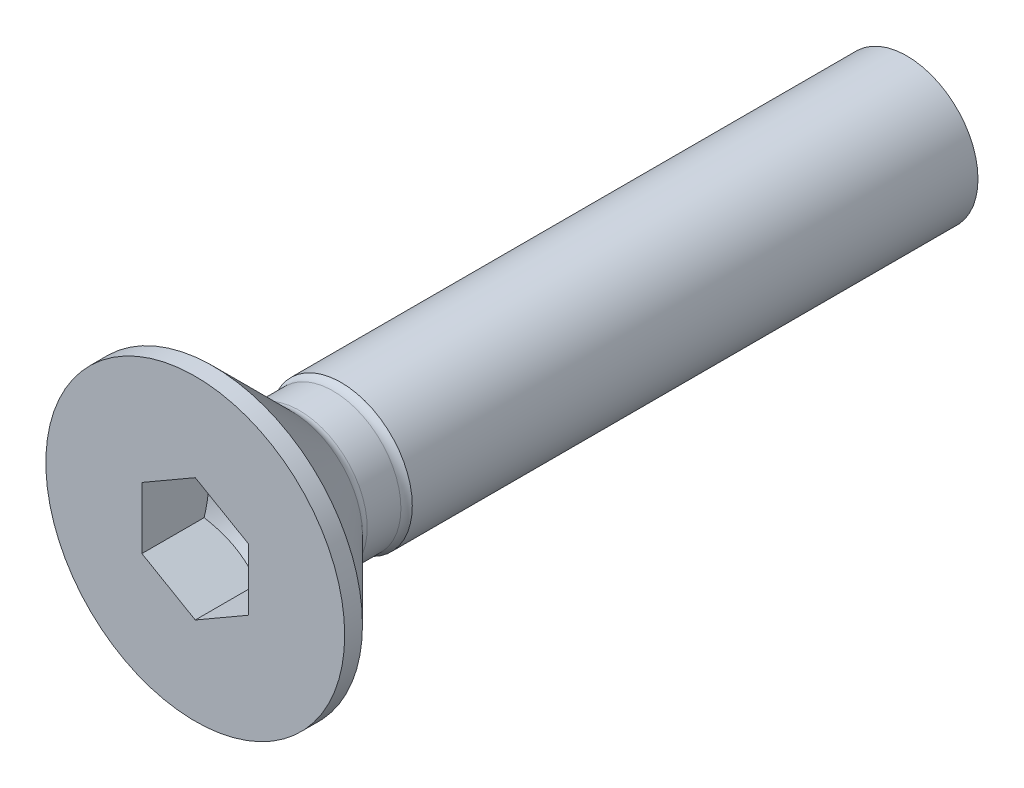
ISO-10303-21;
HEADER;
FILE_DESCRIPTION(('STEP AP214'),'2;1');
FILE_NAME('part.step','',(''),(''),'','','');
FILE_SCHEMA(('AUTOMOTIVE_DESIGN { 1 0 10303 214 1 1 1 1 }'));
ENDSEC;
DATA;
#1=APPLICATION_CONTEXT('core data for automotive mechanical design processes');
#2=APPLICATION_PROTOCOL_DEFINITION('international standard','automotive_design',2000,#1);
#3=PRODUCT_CONTEXT('',#1,'mechanical');
#4=PRODUCT('Part','Part','',(#3));
#5=PRODUCT_RELATED_PRODUCT_CATEGORY('part','',(#4));
#6=PRODUCT_DEFINITION_FORMATION('','',#4);
#7=PRODUCT_DEFINITION_CONTEXT('part definition',#1,'design');
#8=PRODUCT_DEFINITION('design','',#6,#7);
#9=PRODUCT_DEFINITION_SHAPE('','',#8);
#10=(LENGTH_UNIT() NAMED_UNIT(*) SI_UNIT(.MILLI.,.METRE.));
#11=(NAMED_UNIT(*) PLANE_ANGLE_UNIT() SI_UNIT($,.RADIAN.));
#12=(NAMED_UNIT(*) SI_UNIT($,.STERADIAN.) SOLID_ANGLE_UNIT());
#13=UNCERTAINTY_MEASURE_WITH_UNIT(LENGTH_MEASURE(1.E-05),#10,'distance_accuracy_value','');
#14=(GEOMETRIC_REPRESENTATION_CONTEXT(3) GLOBAL_UNCERTAINTY_ASSIGNED_CONTEXT((#13)) GLOBAL_UNIT_ASSIGNED_CONTEXT((#10,
#11,#12)) REPRESENTATION_CONTEXT('',''));
#15=CARTESIAN_POINT('',(0.,0.,0.));
#16=DIRECTION('',(0.,0.,1.));
#17=DIRECTION('',(1.,0.,0.));
#18=AXIS2_PLACEMENT_3D('',#15,#16,#17);
#19=CARTESIAN_POINT('',(0.,4.2,0.));
#20=DIRECTION('',(0.,0.,-1.));
#21=DIRECTION('',(-1.,0.,0.));
#22=AXIS2_PLACEMENT_3D('',#19,#20,#21);
#23=PLANE('',#22);
#24=CARTESIAN_POINT('',(0.,0.,0.));
#25=DIRECTION('',(0.,0.,1.));
#26=DIRECTION('',(1.,0.,0.));
#27=AXIS2_PLACEMENT_3D('',#24,#25,#26);
#28=CIRCLE('',#27,4.2);
#29=CARTESIAN_POINT('',(4.2,0.,0.));
#30=VERTEX_POINT('',#29);
#31=EDGE_CURVE('E107',#30,#30,#28,.T.);
#32=ORIENTED_EDGE('',*,*,#31,.T.);
#33=EDGE_LOOP('',(#32));
#34=FACE_BOUND('',#33,.T.);
#35=DIRECTION('',(-0.866025403784438,-0.5,0.));
#36=VECTOR('',#35,1.);
#37=CARTESIAN_POINT('',(1.49999930062484,-0.866025,0.));
#38=LINE('',#37,#36);
#39=CARTESIAN_POINT('',(1.49999930062484,-0.866025,0.));
#40=VERTEX_POINT('',#39);
#41=CARTESIAN_POINT('',(0.,-1.73205,0.));
#42=VERTEX_POINT('',#41);
#43=EDGE_CURVE('E31',#40,#42,#38,.T.);
#44=ORIENTED_EDGE('',*,*,#43,.T.);
#45=DIRECTION('',(-0.866025403784439,0.5,0.));
#46=VECTOR('',#45,1.);
#47=CARTESIAN_POINT('',(0.,-1.73205,0.));
#48=LINE('',#47,#46);
#49=CARTESIAN_POINT('',(-1.49999930062484,-0.866025,0.));
#50=VERTEX_POINT('',#49);
#51=EDGE_CURVE('E174',#42,#50,#48,.T.);
#52=ORIENTED_EDGE('',*,*,#51,.T.);
#53=DIRECTION('',(0.,1.,0.));
#54=VECTOR('',#53,1.);
#55=CARTESIAN_POINT('',(-1.49999930062484,-0.866025,0.));
#56=LINE('',#55,#54);
#57=CARTESIAN_POINT('',(-1.49999930062484,0.866025,0.));
#58=VERTEX_POINT('',#57);
#59=EDGE_CURVE('E225',#50,#58,#56,.T.);
#60=ORIENTED_EDGE('',*,*,#59,.T.);
#61=DIRECTION('',(0.866025403784439,0.5,0.));
#62=VECTOR('',#61,1.);
#63=CARTESIAN_POINT('',(-1.49999930062484,0.866025,0.));
#64=LINE('',#63,#62);
#65=CARTESIAN_POINT('',(0.,1.73205,0.));
#66=VERTEX_POINT('',#65);
#67=EDGE_CURVE('E223',#58,#66,#64,.T.);
#68=ORIENTED_EDGE('',*,*,#67,.T.);
#69=DIRECTION('',(0.866025403784439,-0.5,0.));
#70=VECTOR('',#69,1.);
#71=CARTESIAN_POINT('',(0.,1.73205,0.));
#72=LINE('',#71,#70);
#73=CARTESIAN_POINT('',(1.49999930062484,0.866025,0.));
#74=VERTEX_POINT('',#73);
#75=EDGE_CURVE('E96',#66,#74,#72,.T.);
#76=ORIENTED_EDGE('',*,*,#75,.T.);
#77=DIRECTION('',(0.,-1.,0.));
#78=VECTOR('',#77,1.);
#79=CARTESIAN_POINT('',(1.49999930062484,0.866025,0.));
#80=LINE('',#79,#78);
#81=EDGE_CURVE('E92',#74,#40,#80,.T.);
#82=ORIENTED_EDGE('',*,*,#81,.T.);
#83=EDGE_LOOP('',(#44,#52,#60,#68,#76,#82));
#84=FACE_BOUND('',#83,.T.);
#85=ADVANCED_FACE('F17',(#34,#84),#23,.F.);
#86=CARTESIAN_POINT('',(0.,0.,-20.));
#87=DIRECTION('',(0.,0.,1.));
#88=DIRECTION('',(1.,0.,0.));
#89=AXIS2_PLACEMENT_3D('',#86,#87,#88);
#90=PLANE('',#89);
#91=CARTESIAN_POINT('',(0.,0.,-20.));
#92=DIRECTION('',(0.,0.,1.));
#93=DIRECTION('',(1.,0.,0.));
#94=AXIS2_PLACEMENT_3D('',#91,#92,#93);
#95=CIRCLE('',#94,2.);
#96=CARTESIAN_POINT('',(2.,0.,-20.));
#97=VERTEX_POINT('',#96);
#98=EDGE_CURVE('E11',#97,#97,#95,.T.);
#99=ORIENTED_EDGE('',*,*,#98,.F.);
#100=EDGE_LOOP('',(#99));
#101=FACE_BOUND('',#100,.T.);
#102=ADVANCED_FACE('F130',(#101),#90,.F.);
#103=CARTESIAN_POINT('',(0.,0.,0.));
#104=DIRECTION('',(0.,0.,1.));
#105=DIRECTION('',(1.,0.,0.));
#106=AXIS2_PLACEMENT_3D('',#103,#104,#105);
#107=CYLINDRICAL_SURFACE('',#106,2.);
#108=CARTESIAN_POINT('',(0.,0.,-4.1));
#109=DIRECTION('',(0.,0.,1.));
#110=DIRECTION('',(1.,0.,0.));
#111=AXIS2_PLACEMENT_3D('',#108,#109,#110);
#112=CIRCLE('',#111,2.);
#113=CARTESIAN_POINT('',(2.,0.,-4.1));
#114=VERTEX_POINT('',#113);
#115=EDGE_CURVE('E24',#114,#114,#112,.T.);
#116=ORIENTED_EDGE('',*,*,#115,.F.);
#117=EDGE_LOOP('',(#116));
#118=FACE_BOUND('',#117,.T.);
#119=ORIENTED_EDGE('',*,*,#98,.T.);
#120=EDGE_LOOP('',(#119));
#121=FACE_BOUND('',#120,.T.);
#122=ADVANCED_FACE('F127',(#118,#121),#107,.T.);
#123=CARTESIAN_POINT('',(0.,0.,-3.8737258300203));
#124=DIRECTION('',(0.,0.,1.));
#125=DIRECTION('',(1.,0.,0.));
#126=AXIS2_PLACEMENT_3D('',#123,#124,#125);
#127=TOROIDAL_SURFACE('',#126,2.2262741699797,0.32);
#128=ORIENTED_EDGE('',*,*,#115,.T.);
#129=EDGE_LOOP('',(#128));
#130=FACE_BOUND('',#129,.T.);
#131=CARTESIAN_POINT('',(0.,0.,-3.8737258300203));
#132=DIRECTION('',(0.,0.,1.));
#133=DIRECTION('',(1.,0.,0.));
#134=AXIS2_PLACEMENT_3D('',#131,#132,#133);
#135=CIRCLE('',#134,1.9062741699797);
#136=CARTESIAN_POINT('',(1.9062741699797,0.,-3.8737258300203));
#137=VERTEX_POINT('',#136);
#138=EDGE_CURVE('E119',#137,#137,#135,.T.);
#139=ORIENTED_EDGE('',*,*,#138,.F.);
#140=EDGE_LOOP('',(#139));
#141=FACE_BOUND('',#140,.T.);
#142=ADVANCED_FACE('F124',(#130,#141),#127,.F.);
#143=CARTESIAN_POINT('',(0.,0.,0.));
#144=DIRECTION('',(0.,0.,1.));
#145=DIRECTION('',(1.,0.,0.));
#146=AXIS2_PLACEMENT_3D('',#143,#144,#145);
#147=CYLINDRICAL_SURFACE('',#146,1.9062741699797);
#148=CARTESIAN_POINT('',(0.,0.,-2.9262741699797));
#149=DIRECTION('',(0.,0.,1.));
#150=DIRECTION('',(1.,0.,0.));
#151=AXIS2_PLACEMENT_3D('',#148,#149,#150);
#152=CIRCLE('',#151,1.9062741699797);
#153=CARTESIAN_POINT('',(1.9062741699797,0.,-2.9262741699797));
#154=VERTEX_POINT('',#153);
#155=EDGE_CURVE('E116',#154,#154,#152,.T.);
#156=ORIENTED_EDGE('',*,*,#155,.F.);
#157=EDGE_LOOP('',(#156));
#158=FACE_BOUND('',#157,.T.);
#159=ORIENTED_EDGE('',*,*,#138,.T.);
#160=EDGE_LOOP('',(#159));
#161=FACE_BOUND('',#160,.T.);
#162=ADVANCED_FACE('F143',(#158,#161),#147,.T.);
#163=CARTESIAN_POINT('',(0.,0.,-2.9262741699797));
#164=DIRECTION('',(0.,0.,1.));
#165=DIRECTION('',(1.,0.,0.));
#166=AXIS2_PLACEMENT_3D('',#163,#164,#165);
#167=TOROIDAL_SURFACE('',#166,2.2262741699797,0.32);
#168=ORIENTED_EDGE('',*,*,#155,.T.);
#169=EDGE_LOOP('',(#168));
#170=FACE_BOUND('',#169,.T.);
#171=CARTESIAN_POINT('',(0.,0.,-2.7));
#172=DIRECTION('',(0.,0.,1.));
#173=DIRECTION('',(1.,0.,0.));
#174=AXIS2_PLACEMENT_3D('',#171,#172,#173);
#175=CIRCLE('',#174,2.);
#176=CARTESIAN_POINT('',(2.,0.,-2.7));
#177=VERTEX_POINT('',#176);
#178=EDGE_CURVE('E113',#177,#177,#175,.T.);
#179=ORIENTED_EDGE('',*,*,#178,.F.);
#180=EDGE_LOOP('',(#179));
#181=FACE_BOUND('',#180,.T.);
#182=ADVANCED_FACE('F146',(#170,#181),#167,.F.);
#183=CARTESIAN_POINT('',(0.,0.,-2.7));
#184=DIRECTION('',(0.,0.,1.));
#185=DIRECTION('',(1.,0.,0.));
#186=AXIS2_PLACEMENT_3D('',#183,#184,#185);
#187=CONICAL_SURFACE('',#186,2.,0.785398163397448);
#188=CARTESIAN_POINT('',(0.,0.,-0.5));
#189=DIRECTION('',(0.,0.,1.));
#190=DIRECTION('',(1.,0.,0.));
#191=AXIS2_PLACEMENT_3D('',#188,#189,#190);
#192=CIRCLE('',#191,4.2);
#193=CARTESIAN_POINT('',(4.2,0.,-0.5));
#194=VERTEX_POINT('',#193);
#195=EDGE_CURVE('E110',#194,#194,#192,.T.);
#196=ORIENTED_EDGE('',*,*,#195,.F.);
#197=EDGE_LOOP('',(#196));
#198=FACE_BOUND('',#197,.T.);
#199=ORIENTED_EDGE('',*,*,#178,.T.);
#200=EDGE_LOOP('',(#199));
#201=FACE_BOUND('',#200,.T.);
#202=ADVANCED_FACE('F150',(#198,#201),#187,.T.);
#203=CARTESIAN_POINT('',(0.,0.,0.));
#204=DIRECTION('',(0.,0.,1.));
#205=DIRECTION('',(1.,0.,0.));
#206=AXIS2_PLACEMENT_3D('',#203,#204,#205);
#207=CYLINDRICAL_SURFACE('',#206,4.2);
#208=ORIENTED_EDGE('',*,*,#31,.F.);
#209=EDGE_LOOP('',(#208));
#210=FACE_BOUND('',#209,.T.);
#211=ORIENTED_EDGE('',*,*,#195,.T.);
#212=EDGE_LOOP('',(#211));
#213=FACE_BOUND('',#212,.T.);
#214=ADVANCED_FACE('F154',(#210,#213),#207,.T.);
#215=CARTESIAN_POINT('',(1.49999930062484,-0.866025,-2.74999953374989));
#216=DIRECTION('',(-0.5,0.866025403784438,0.));
#217=DIRECTION('',(0.866025403784439,0.5,0.));
#218=AXIS2_PLACEMENT_3D('',#215,#216,#217);
#219=PLANE('',#218);
#220=DIRECTION('',(0.,0.,1.));
#221=VECTOR('',#220,1.);
#222=CARTESIAN_POINT('',(0.,-1.73205,-2.74999953374989));
#223=LINE('',#222,#221);
#224=CARTESIAN_POINT('',(0.,-1.73205,-1.75));
#225=VERTEX_POINT('',#224);
#226=EDGE_CURVE('E105',#225,#42,#223,.T.);
#227=ORIENTED_EDGE('',*,*,#226,.T.);
#228=ORIENTED_EDGE('',*,*,#43,.F.);
#229=DIRECTION('',(0.,0.,1.));
#230=VECTOR('',#229,1.);
#231=CARTESIAN_POINT('',(1.49999930062484,-0.866025,-2.74999953374989));
#232=LINE('',#231,#230);
#233=CARTESIAN_POINT('',(1.49999930062484,-0.866025,-1.75));
#234=VERTEX_POINT('',#233);
#235=EDGE_CURVE('E86',#234,#40,#232,.T.);
#236=ORIENTED_EDGE('',*,*,#235,.F.);
#237=CARTESIAN_POINT('',(-1.99999999680739E-07,-1.73205011547005,-1.74999993333332));
#238=CARTESIAN_POINT('',(0.0659156883140374,-1.69399355960807,-1.77197826971665));
#239=CARTESIAN_POINT('',(0.132400561630831,-1.65560850010158,-1.79196641723317));
#240=CARTESIAN_POINT('',(0.266521449648073,-1.57817376930088,-1.82685513031264));
#241=CARTESIAN_POINT('',(0.334159846643437,-1.53912272258805,-1.84174335491524));
#242=CARTESIAN_POINT('',(0.468598431785278,-1.46150456926693,-1.86491795250505));
#243=CARTESIAN_POINT('',(0.535377940612902,-1.42294940186895,-1.87335858322253));
#244=CARTESIAN_POINT('',(0.669251014383081,-1.3456577466905,-1.88343305499451));
#245=CARTESIAN_POINT('',(0.736344093066486,-1.30692153965187,-1.88507524057936));
#246=CARTESIAN_POINT('',(0.861700339375889,-1.23454707710054,-1.88165022910074));
#247=CARTESIAN_POINT('',(0.919982317618543,-1.20089796127324,-1.87742398588357));
#248=CARTESIAN_POINT('',(1.03616658598195,-1.13381894265803,-1.86403197749463));
#249=CARTESIAN_POINT('',(1.09406847455153,-1.10038927170579,-1.8548616421055));
#250=CARTESIAN_POINT('',(1.21049209394498,-1.03317206370895,-1.83193757598473));
#251=CARTESIAN_POINT('',(1.26899909720332,-0.99939302962827,-1.81808671686208));
#252=CARTESIAN_POINT('',(1.38514072357652,-0.932338630377582,-1.78665112132236));
#253=CARTESIAN_POINT('',(1.44277683345494,-0.899062406824236,-1.76907376628985));
#254=CARTESIAN_POINT('',(1.49999950062484,-0.866024884529945,-1.74999993333332));
#255=B_SPLINE_CURVE_WITH_KNOTS('',3,(#237,#238,#239,#240,#241,#242,#243,#244,#245,#246,#247,
#248,#249,#250,#251,#252,#253,#254),.UNSPECIFIED.,.F.,.F.,(4,2,2,2,2,2,2,2,4),(0.,
0.237761913623106,0.476095172847885,0.708530420620331,0.940680288567599,1.14278046683928,
1.34506778348019,1.5518408666055,1.75820814090333),.UNSPECIFIED.);
#256=EDGE_CURVE('E79',#225,#234,#255,.T.);
#257=ORIENTED_EDGE('',*,*,#256,.F.);
#258=EDGE_LOOP('',(#227,#228,#236,#257));
#259=FACE_BOUND('',#258,.T.);
#260=ADVANCED_FACE('F87',(#259),#219,.T.);
#261=CARTESIAN_POINT('',(0.,-1.73205,-2.74999953374989));
#262=DIRECTION('',(0.5,0.866025403784439,0.));
#263=DIRECTION('',(0.866025403784439,-0.5,0.));
#264=AXIS2_PLACEMENT_3D('',#261,#262,#263);
#265=PLANE('',#264);
#266=DIRECTION('',(0.,0.,1.));
#267=VECTOR('',#266,1.);
#268=CARTESIAN_POINT('',(-1.49999930062484,-0.866025,-2.74999953374989));
#269=LINE('',#268,#267);
#270=CARTESIAN_POINT('',(-1.49999930062484,-0.866025,-1.75));
#271=VERTEX_POINT('',#270);
#272=EDGE_CURVE('E103',#271,#50,#269,.T.);
#273=ORIENTED_EDGE('',*,*,#272,.T.);
#274=ORIENTED_EDGE('',*,*,#51,.F.);
#275=ORIENTED_EDGE('',*,*,#226,.F.);
#276=CARTESIAN_POINT('',(-1.49999950062484,-0.866024884529947,-1.74999993333332));
#277=CARTESIAN_POINT('',(-1.4340836123108,-0.904081440391929,-1.77197826971665));
#278=CARTESIAN_POINT('',(-1.36759873899401,-0.942466499898418,-1.79196641723317));
#279=CARTESIAN_POINT('',(-1.23347785097676,-1.01990123069912,-1.82685513031264));
#280=CARTESIAN_POINT('',(-1.1658394539814,-1.05895227741195,-1.84174335491524));
#281=CARTESIAN_POINT('',(-1.03140086883956,-1.13657043073307,-1.86491795250505));
#282=CARTESIAN_POINT('',(-0.964621360011935,-1.17512559813105,-1.87335858322253));
#283=CARTESIAN_POINT('',(-0.830748286241757,-1.2524172533095,-1.88343305499451));
#284=CARTESIAN_POINT('',(-0.763655207558351,-1.29115346034813,-1.88507524057936));
#285=CARTESIAN_POINT('',(-0.638298961248948,-1.36352792289946,-1.88165022910074));
#286=CARTESIAN_POINT('',(-0.580016983006295,-1.39717703872676,-1.87742398588357));
#287=CARTESIAN_POINT('',(-0.46383271464289,-1.46425605734197,-1.86403197749463));
#288=CARTESIAN_POINT('',(-0.405930826073305,-1.49768572829421,-1.8548616421055));
#289=CARTESIAN_POINT('',(-0.289507206679853,-1.56490293629105,-1.83193757598473));
#290=CARTESIAN_POINT('',(-0.231000203421515,-1.59868197037173,-1.81808671686208));
#291=CARTESIAN_POINT('',(-0.114858577048315,-1.66573636962242,-1.78665112132236));
#292=CARTESIAN_POINT('',(-0.0572224671698999,-1.69901259317576,-1.76907376628985));
#293=CARTESIAN_POINT('',(2.00000000349948E-07,-1.73205011547005,-1.74999993333332));
#294=B_SPLINE_CURVE_WITH_KNOTS('',3,(#276,#277,#278,#279,#280,#281,#282,#283,#284,#285,#286,
#287,#288,#289,#290,#291,#292,#293),.UNSPECIFIED.,.F.,.F.,(4,2,2,2,2,2,2,2,4),(0.,
0.237761913623106,0.476095172847884,0.70853042062033,0.940680288567598,1.14278046683928,
1.34506778348018,1.5518408666055,1.75820814090332),.UNSPECIFIED.);
#295=EDGE_CURVE('E83',#271,#225,#294,.T.);
#296=ORIENTED_EDGE('',*,*,#295,.F.);
#297=EDGE_LOOP('',(#273,#274,#275,#296));
#298=FACE_BOUND('',#297,.T.);
#299=ADVANCED_FACE('F162',(#298),#265,.T.);
#300=CARTESIAN_POINT('',(-1.49999930062484,-0.866025,-2.74999953374989));
#301=DIRECTION('',(1.,0.,0.));
#302=DIRECTION('',(0.,-1.,0.));
#303=AXIS2_PLACEMENT_3D('',#300,#301,#302);
#304=PLANE('',#303);
#305=DIRECTION('',(0.,0.,1.));
#306=VECTOR('',#305,1.);
#307=CARTESIAN_POINT('',(-1.49999930062484,0.866025,-2.74999953374989));
#308=LINE('',#307,#306);
#309=CARTESIAN_POINT('',(-1.49999930062484,0.866025,-1.75));
#310=VERTEX_POINT('',#309);
#311=EDGE_CURVE('E101',#310,#58,#308,.T.);
#312=ORIENTED_EDGE('',*,*,#311,.T.);
#313=ORIENTED_EDGE('',*,*,#59,.F.);
#314=ORIENTED_EDGE('',*,*,#272,.F.);
#315=CARTESIAN_POINT('',(-1.49999930062484,-2.24271663728987,-1.19224732655606));
#316=CARTESIAN_POINT('',(-1.49999930062484,-2.17794141332948,-1.2233240386434));
#317=CARTESIAN_POINT('',(-1.49999930062484,-2.11300852131877,-1.25407788378193));
#318=CARTESIAN_POINT('',(-1.49999930062484,-1.98274303133747,-1.31475688836461));
#319=CARTESIAN_POINT('',(-1.49999930062484,-1.91741036398295,-1.34468189867359));
#320=CARTESIAN_POINT('',(-1.49999930062484,-1.78588635402014,-1.40368745902238));
#321=CARTESIAN_POINT('',(-1.49999930062484,-1.71969220668951,-1.43276178539196));
#322=CARTESIAN_POINT('',(-1.49999930062484,-1.58674953033079,-1.48960603309075));
#323=CARTESIAN_POINT('',(-1.49999930062484,-1.52000103034101,-1.51737602224337));
#324=CARTESIAN_POINT('',(-1.49999930062484,-1.3840803609041,-1.57197454354563));
#325=CARTESIAN_POINT('',(-1.49999930062484,-1.31489044693085,-1.59875948860863));
#326=CARTESIAN_POINT('',(-1.49999930062484,-1.17568875841829,-1.65009347176015));
#327=CARTESIAN_POINT('',(-1.49999930062484,-1.10567688213164,-1.67464222967457));
#328=CARTESIAN_POINT('',(-1.49999930062484,-0.894522216326041,-1.74389891659258));
#329=CARTESIAN_POINT('',(-1.49999930062484,-0.751873977107305,-1.78437972558077));
#330=CARTESIAN_POINT('',(-1.49999930062484,-0.535047450977377,-1.83133547387975));
#331=CARTESIAN_POINT('',(-1.49999930062484,-0.462365424606004,-1.8446870831194));
#332=CARTESIAN_POINT('',(-1.49999930062484,-0.316183762846173,-1.86588652327433));
#333=CARTESIAN_POINT('',(-1.49999930062484,-0.242684183050493,-1.8737347261193));
#334=CARTESIAN_POINT('',(-1.49999930062484,-0.0961588910043363,-1.88320140065941));
#335=CARTESIAN_POINT('',(-1.49999930062484,-0.0231380525219725,-1.88489338760043));
#336=CARTESIAN_POINT('',(-1.49999930062484,0.122783022434944,-1.8821005129235));
#337=CARTESIAN_POINT('',(-1.49999930062484,0.195683251162014,-1.87761526883626));
#338=CARTESIAN_POINT('',(-1.49999930062484,0.375553746456918,-1.85932231507839));
#339=CARTESIAN_POINT('',(-1.49999930062484,0.482175447205275,-1.84208645808823));
#340=CARTESIAN_POINT('',(-1.49999930062484,0.693345462610581,-1.79764015601861));
#341=CARTESIAN_POINT('',(-1.49999930062484,0.797891117586182,-1.77041768916732));
#342=CARTESIAN_POINT('',(-1.49999930062484,0.954250638106052,-1.72391506406641));
#343=CARTESIAN_POINT('',(-1.49999930062484,1.00687274489346,-1.70725248222542));
#344=CARTESIAN_POINT('',(-1.49999930062484,1.11156919653989,-1.67238593435544));
#345=CARTESIAN_POINT('',(-1.49999930062484,1.16364386074615,-1.65418293026923));
#346=CARTESIAN_POINT('',(-1.49999930062484,1.26731501759716,-1.61649989905804));
#347=CARTESIAN_POINT('',(-1.49999930062484,1.31891159520743,-1.59702010401285));
#348=CARTESIAN_POINT('',(-1.49999930062484,1.4216981870033,-1.55699419612349));
#349=CARTESIAN_POINT('',(-1.49999930062484,1.472888130803,-1.53644790312054));
#350=CARTESIAN_POINT('',(-1.49999930062484,1.60355204827236,-1.48268670520898));
#351=CARTESIAN_POINT('',(-1.49999930062484,1.68276475840259,-1.44883749105937));
#352=CARTESIAN_POINT('',(-1.49999930062484,1.84047486348128,-1.37950734216129));
#353=CARTESIAN_POINT('',(-1.49999930062484,1.91897220431401,-1.34402628517604));
#354=CARTESIAN_POINT('',(-1.49999930062484,2.15362953028614,-1.23571059000565));
#355=CARTESIAN_POINT('',(-1.49999930062484,2.30892860814982,-1.16101453187262));
#356=CARTESIAN_POINT('',(-1.49999930062484,2.61819999305394,-1.00848967602052));
#357=CARTESIAN_POINT('',(-1.49999930062484,2.77217043436165,-0.930657140019653));
#358=CARTESIAN_POINT('',(-1.49999930062484,3.07905639824251,-0.772990738398717));
#359=CARTESIAN_POINT('',(-1.49999930062484,3.23197205178397,-0.693157127162421));
#360=CARTESIAN_POINT('',(-1.49999930062484,3.52267463488272,-0.539711530968817));
#361=CARTESIAN_POINT('',(-1.49999930062484,3.66052723146041,-0.466223520484862));
#362=CARTESIAN_POINT('',(-1.49999930062484,3.93578899181439,-0.318410175118091));
#363=CARTESIAN_POINT('',(-1.49999930062484,4.07319813893701,-0.244084809248649));
#364=CARTESIAN_POINT('',(-1.49999930062484,4.34732572273338,-0.0949965837001696));
#365=CARTESIAN_POINT('',(-1.49999930062484,4.48404502727542,-0.0202353176334689));
#366=CARTESIAN_POINT('',(-1.49999930062484,4.75720722150035,0.129773804682777));
#367=CARTESIAN_POINT('',(-1.49999930062484,4.89365012527411,0.205021635263442));
#368=CARTESIAN_POINT('',(-1.49999930062484,5.02999372439214,0.280447890272913));
#369=B_SPLINE_CURVE_WITH_KNOTS('',3,(#315,#316,#317,#318,#319,#320,#321,#322,#323,#324,#325,
#326,#327,#328,#329,#330,#331,#332,#333,#334,#335,#336,#337,#338,#339,#340,#341,#342,#343,#344,
#345,#346,#347,#348,#349,#350,#351,#352,#353,#354,#355,#356,#357,#358,#359,#360,#361,#362,#363,
#364,#365,#366,#367,#368),.UNSPECIFIED.,.F.,.F.,(4,2,2,2,2,2,2,2,2,2,2,2,2,2,2,2,2,2,2,2,2,2,2,
2,2,2,4),(0.,0.215535408956196,0.431109351278167,0.647990972797856,0.864861304313613,
1.08740082366361,1.30996818696955,1.75384735851112,1.97537373295003,2.19688513481169,
2.41574248382809,2.63461338422011,2.95796620177289,3.28170955208695,3.4472828330585,
3.61275347137016,3.77819411537379,3.94366279806472,4.20206177941054,4.46048014832696,
4.97740223788562,5.49495979450924,6.012451887764,6.48110033243706,6.94976617694737,
7.41723996592479,7.88468929116012),.UNSPECIFIED.);
#370=EDGE_CURVE('E199',#310,#271,#369,.F.);
#371=ORIENTED_EDGE('',*,*,#370,.F.);
#372=EDGE_LOOP('',(#312,#313,#314,#371));
#373=FACE_BOUND('',#372,.T.);
#374=ADVANCED_FACE('F203',(#373),#304,.T.);
#375=CARTESIAN_POINT('',(-1.49999930062484,0.866025,-2.74999953374989));
#376=DIRECTION('',(0.5,-0.866025403784439,0.));
#377=DIRECTION('',(-0.866025403784439,-0.5,0.));
#378=AXIS2_PLACEMENT_3D('',#375,#376,#377);
#379=PLANE('',#378);
#380=DIRECTION('',(0.,0.,1.));
#381=VECTOR('',#380,1.);
#382=CARTESIAN_POINT('',(0.,1.73205,-2.74999953374989));
#383=LINE('',#382,#381);
#384=CARTESIAN_POINT('',(0.,1.73205,-1.75));
#385=VERTEX_POINT('',#384);
#386=EDGE_CURVE('E94',#385,#66,#383,.T.);
#387=ORIENTED_EDGE('',*,*,#386,.T.);
#388=ORIENTED_EDGE('',*,*,#67,.F.);
#389=ORIENTED_EDGE('',*,*,#311,.F.);
#390=CARTESIAN_POINT('',(1.99999999841384E-07,1.73205011547005,-1.74999993333332));
#391=CARTESIAN_POINT('',(-0.0659156883140364,1.69399355960807,-1.77197826971665));
#392=CARTESIAN_POINT('',(-0.13240056163083,1.65560850010158,-1.79196641723317));
#393=CARTESIAN_POINT('',(-0.266521449648072,1.57817376930088,-1.82685513031264));
#394=CARTESIAN_POINT('',(-0.334159846643437,1.53912272258805,-1.84174335491524));
#395=CARTESIAN_POINT('',(-0.468598431785278,1.46150456926693,-1.86491795250505));
#396=CARTESIAN_POINT('',(-0.535377940612901,1.42294940186895,-1.87335858322253));
#397=CARTESIAN_POINT('',(-0.66925101438308,1.3456577466905,-1.88343305499451));
#398=CARTESIAN_POINT('',(-0.736344093066486,1.30692153965187,-1.88507524057936));
#399=CARTESIAN_POINT('',(-0.861700339375889,1.23454707710054,-1.88165022910074));
#400=CARTESIAN_POINT('',(-0.919982317618542,1.20089796127324,-1.87742398588357));
#401=CARTESIAN_POINT('',(-1.03616658598195,1.13381894265803,-1.86403197749463));
#402=CARTESIAN_POINT('',(-1.09406847455153,1.10038927170579,-1.8548616421055));
#403=CARTESIAN_POINT('',(-1.21049209394498,1.03317206370895,-1.83193757598473));
#404=CARTESIAN_POINT('',(-1.26899909720332,0.99939302962827,-1.81808671686208));
#405=CARTESIAN_POINT('',(-1.38514072357652,0.932338630377582,-1.78665112132236));
#406=CARTESIAN_POINT('',(-1.44277683345494,0.899062406824237,-1.76907376628985));
#407=CARTESIAN_POINT('',(-1.49999950062484,0.866024884529946,-1.74999993333332));
#408=B_SPLINE_CURVE_WITH_KNOTS('',3,(#390,#391,#392,#393,#394,#395,#396,#397,#398,#399,#400,
#401,#402,#403,#404,#405,#406,#407),.UNSPECIFIED.,.F.,.F.,(4,2,2,2,2,2,2,2,4),(0.,
0.237761913623107,0.476095172847885,0.708530420620331,0.940680288567599,1.14278046683928,
1.34506778348018,1.5518408666055,1.75820814090332),.UNSPECIFIED.);
#409=EDGE_CURVE('E194',#385,#310,#408,.T.);
#410=ORIENTED_EDGE('',*,*,#409,.F.);
#411=EDGE_LOOP('',(#387,#388,#389,#410));
#412=FACE_BOUND('',#411,.T.);
#413=ADVANCED_FACE('F206',(#412),#379,.T.);
#414=CARTESIAN_POINT('',(0.,1.73205,-2.74999953374989));
#415=DIRECTION('',(-0.5,-0.866025403784439,0.));
#416=DIRECTION('',(-0.866025403784439,0.5,0.));
#417=AXIS2_PLACEMENT_3D('',#414,#415,#416);
#418=PLANE('',#417);
#419=DIRECTION('',(0.,0.,1.));
#420=VECTOR('',#419,1.);
#421=CARTESIAN_POINT('',(1.49999930062484,0.866025,-2.74999953374989));
#422=LINE('',#421,#420);
#423=CARTESIAN_POINT('',(1.49999930062484,0.866025,-1.75));
#424=VERTEX_POINT('',#423);
#425=EDGE_CURVE('E91',#424,#74,#422,.T.);
#426=ORIENTED_EDGE('',*,*,#425,.T.);
#427=ORIENTED_EDGE('',*,*,#75,.F.);
#428=ORIENTED_EDGE('',*,*,#386,.F.);
#429=CARTESIAN_POINT('',(1.49999950062484,0.866024884529947,-1.74999993333332));
#430=CARTESIAN_POINT('',(1.4340836123108,0.90408144039193,-1.77197826971665));
#431=CARTESIAN_POINT('',(1.36759873899401,0.942466499898419,-1.79196641723317));
#432=CARTESIAN_POINT('',(1.23347785097676,1.01990123069912,-1.82685513031264));
#433=CARTESIAN_POINT('',(1.1658394539814,1.05895227741195,-1.84174335491524));
#434=CARTESIAN_POINT('',(1.03140086883956,1.13657043073307,-1.86491795250505));
#435=CARTESIAN_POINT('',(0.964621360011935,1.17512559813105,-1.87335858322253));
#436=CARTESIAN_POINT('',(0.830748286241757,1.2524172533095,-1.88343305499451));
#437=CARTESIAN_POINT('',(0.763655207558351,1.29115346034813,-1.88507524057936));
#438=CARTESIAN_POINT('',(0.638298961248948,1.36352792289946,-1.88165022910074));
#439=CARTESIAN_POINT('',(0.580016983006295,1.39717703872676,-1.87742398588357));
#440=CARTESIAN_POINT('',(0.46383271464289,1.46425605734197,-1.86403197749463));
#441=CARTESIAN_POINT('',(0.405930826073305,1.49768572829421,-1.8548616421055));
#442=CARTESIAN_POINT('',(0.289507206679854,1.56490293629105,-1.83193757598473));
#443=CARTESIAN_POINT('',(0.231000203421515,1.59868197037173,-1.81808671686208));
#444=CARTESIAN_POINT('',(0.114858577048315,1.66573636962242,-1.78665112132236));
#445=CARTESIAN_POINT('',(0.0572224671699001,1.69901259317576,-1.76907376628985));
#446=CARTESIAN_POINT('',(-2.00000000340445E-07,1.73205011547005,-1.74999993333332));
#447=B_SPLINE_CURVE_WITH_KNOTS('',3,(#429,#430,#431,#432,#433,#434,#435,#436,#437,#438,#439,
#440,#441,#442,#443,#444,#445,#446),.UNSPECIFIED.,.F.,.F.,(4,2,2,2,2,2,2,2,4),(0.,
0.237761913623106,0.476095172847884,0.70853042062033,0.940680288567598,1.14278046683928,
1.34506778348018,1.5518408666055,1.75820814090332),.UNSPECIFIED.);
#448=EDGE_CURVE('E39',#424,#385,#447,.T.);
#449=ORIENTED_EDGE('',*,*,#448,.F.);
#450=EDGE_LOOP('',(#426,#427,#428,#449));
#451=FACE_BOUND('',#450,.T.);
#452=ADVANCED_FACE('F210',(#451),#418,.T.);
#453=CARTESIAN_POINT('',(1.49999930062484,0.866025,-2.74999953374989));
#454=DIRECTION('',(-1.,0.,0.));
#455=DIRECTION('',(0.,1.,0.));
#456=AXIS2_PLACEMENT_3D('',#453,#454,#455);
#457=PLANE('',#456);
#458=ORIENTED_EDGE('',*,*,#235,.T.);
#459=ORIENTED_EDGE('',*,*,#81,.F.);
#460=ORIENTED_EDGE('',*,*,#425,.F.);
#461=CARTESIAN_POINT('',(1.49999930062484,-2.24271663728987,-1.19224732655605));
#462=CARTESIAN_POINT('',(1.49999930062484,-2.17794141332948,-1.2233240386434));
#463=CARTESIAN_POINT('',(1.49999930062484,-2.11300852131877,-1.25407788378193));
#464=CARTESIAN_POINT('',(1.49999930062484,-1.98274303133747,-1.31475688836461));
#465=CARTESIAN_POINT('',(1.49999930062484,-1.91741036398295,-1.34468189867359));
#466=CARTESIAN_POINT('',(1.49999930062484,-1.78588635402014,-1.40368745902238));
#467=CARTESIAN_POINT('',(1.49999930062484,-1.71969220668951,-1.43276178539195));
#468=CARTESIAN_POINT('',(1.49999930062484,-1.58674953033078,-1.48960603309075));
#469=CARTESIAN_POINT('',(1.49999930062484,-1.520001030341,-1.51737602224337));
#470=CARTESIAN_POINT('',(1.49999930062484,-1.3840803609041,-1.57197454354563));
#471=CARTESIAN_POINT('',(1.49999930062484,-1.31489044693085,-1.59875948860863));
#472=CARTESIAN_POINT('',(1.49999930062484,-1.17568875841829,-1.65009347176016));
#473=CARTESIAN_POINT('',(1.49999930062484,-1.10567688213164,-1.67464222967457));
#474=CARTESIAN_POINT('',(1.49999930062484,-0.894522216326038,-1.74389891659258));
#475=CARTESIAN_POINT('',(1.49999930062484,-0.751873977107303,-1.78437972558077));
#476=CARTESIAN_POINT('',(1.49999930062484,-0.535047450977375,-1.83133547387975));
#477=CARTESIAN_POINT('',(1.49999930062484,-0.462365424606002,-1.8446870831194));
#478=CARTESIAN_POINT('',(1.49999930062484,-0.316183762846172,-1.86588652327433));
#479=CARTESIAN_POINT('',(1.49999930062484,-0.242684183050491,-1.8737347261193));
#480=CARTESIAN_POINT('',(1.49999930062484,-0.0961588910043344,-1.88320140065941));
#481=CARTESIAN_POINT('',(1.49999930062484,-0.0231380525219704,-1.88489338760043));
#482=CARTESIAN_POINT('',(1.49999930062484,0.122783022434947,-1.8821005129235));
#483=CARTESIAN_POINT('',(1.49999930062484,0.195683251162016,-1.87761526883625));
#484=CARTESIAN_POINT('',(1.49999930062484,0.375553746456921,-1.85932231507838));
#485=CARTESIAN_POINT('',(1.49999930062484,0.482175447205278,-1.84208645808823));
#486=CARTESIAN_POINT('',(1.49999930062484,0.693345462610585,-1.79764015601861));
#487=CARTESIAN_POINT('',(1.49999930062484,0.797891117586186,-1.77041768916732));
#488=CARTESIAN_POINT('',(1.49999930062484,0.954250638106056,-1.72391506406641));
#489=CARTESIAN_POINT('',(1.49999930062484,1.00687274489346,-1.70725248222542));
#490=CARTESIAN_POINT('',(1.49999930062484,1.1115691965399,-1.67238593435544));
#491=CARTESIAN_POINT('',(1.49999930062484,1.16364386074616,-1.65418293026923));
#492=CARTESIAN_POINT('',(1.49999930062484,1.26731501759717,-1.61649989905804));
#493=CARTESIAN_POINT('',(1.49999930062484,1.31891159520743,-1.59702010401285));
#494=CARTESIAN_POINT('',(1.49999930062484,1.4216981870033,-1.55699419612349));
#495=CARTESIAN_POINT('',(1.49999930062484,1.47288813080301,-1.53644790312054));
#496=CARTESIAN_POINT('',(1.49999930062484,1.60355204827237,-1.48268670520898));
#497=CARTESIAN_POINT('',(1.49999930062484,1.68276475840259,-1.44883749105937));
#498=CARTESIAN_POINT('',(1.49999930062483,1.84047486348128,-1.37950734216129));
#499=CARTESIAN_POINT('',(1.49999930062483,1.91897220431401,-1.34402628517604));
#500=CARTESIAN_POINT('',(1.49999930062483,2.15362953028615,-1.23571059000565));
#501=CARTESIAN_POINT('',(1.49999930062483,2.30892860814983,-1.16101453187262));
#502=CARTESIAN_POINT('',(1.49999930062483,2.61819999305394,-1.00848967602052));
#503=CARTESIAN_POINT('',(1.49999930062483,2.77217043436165,-0.930657140019654));
#504=CARTESIAN_POINT('',(1.49999930062483,3.07905639824251,-0.772990738398719));
#505=CARTESIAN_POINT('',(1.49999930062483,3.23197205178396,-0.693157127162424));
#506=CARTESIAN_POINT('',(1.49999930062483,3.52267463488272,-0.53971153096882));
#507=CARTESIAN_POINT('',(1.49999930062483,3.66052723146041,-0.466223520484865));
#508=CARTESIAN_POINT('',(1.49999930062483,3.93578899181439,-0.318410175118094));
#509=CARTESIAN_POINT('',(1.49999930062483,4.07319813893701,-0.244084809248652));
#510=CARTESIAN_POINT('',(1.49999930062483,4.34732572273338,-0.0949965837001719));
#511=CARTESIAN_POINT('',(1.49999930062483,4.48404502727542,-0.0202353176334704));
#512=CARTESIAN_POINT('',(1.49999930062483,4.75720722150035,0.129773804682776));
#513=CARTESIAN_POINT('',(1.49999930062483,4.89365012527411,0.205021635263442));
#514=CARTESIAN_POINT('',(1.49999930062483,5.02999372439214,0.280447890272913));
#515=B_SPLINE_CURVE_WITH_KNOTS('',3,(#461,#462,#463,#464,#465,#466,#467,#468,#469,#470,#471,
#472,#473,#474,#475,#476,#477,#478,#479,#480,#481,#482,#483,#484,#485,#486,#487,#488,#489,#490,
#491,#492,#493,#494,#495,#496,#497,#498,#499,#500,#501,#502,#503,#504,#505,#506,#507,#508,#509,
#510,#511,#512,#513,#514),.UNSPECIFIED.,.F.,.F.,(4,2,2,2,2,2,2,2,2,2,2,2,2,2,2,2,2,2,2,2,2,2,2,
2,2,2,4),(0.,0.215535408956197,0.431109351278168,0.647990972797858,0.864861304313616,
1.08740082366362,1.30996818696956,1.75384735851113,1.97537373295003,2.19688513481169,
2.4157424838281,2.63461338422011,2.9579662017729,3.28170955208696,3.44728283305851,
3.61275347137016,3.77819411537379,3.94366279806472,4.20206177941055,4.46048014832696,
4.97740223788563,5.49495979450924,6.01245188776399,6.48110033243705,6.94976617694737,
7.41723996592479,7.88468929116012),.UNSPECIFIED.);
#516=EDGE_CURVE('E80',#234,#424,#515,.T.);
#517=ORIENTED_EDGE('',*,*,#516,.F.);
#518=EDGE_LOOP('',(#458,#459,#460,#517));
#519=FACE_BOUND('',#518,.T.);
#520=ADVANCED_FACE('F75',(#519),#457,.T.);
#521=CARTESIAN_POINT('',(0.,0.,-2.74999953374989));
#522=DIRECTION('',(0.,0.,1.));
#523=DIRECTION('',(1.,0.,0.));
#524=AXIS2_PLACEMENT_3D('',#521,#522,#523);
#525=CONICAL_SURFACE('',#524,0.,1.0471975511966);
#526=CARTESIAN_POINT('',(0.,0.,-2.74999953374989));
#527=VERTEX_POINT('',#526);
#528=VERTEX_LOOP('',#527);
#529=FACE_BOUND('',#528,.T.);
#530=ORIENTED_EDGE('',*,*,#256,.T.);
#531=ORIENTED_EDGE('',*,*,#516,.T.);
#532=ORIENTED_EDGE('',*,*,#448,.T.);
#533=ORIENTED_EDGE('',*,*,#409,.T.);
#534=ORIENTED_EDGE('',*,*,#370,.T.);
#535=ORIENTED_EDGE('',*,*,#295,.T.);
#536=EDGE_LOOP('',(#530,#531,#532,#533,#534,#535));
#537=FACE_BOUND('',#536,.T.);
#538=ADVANCED_FACE('F72',(#529,#537),#525,.F.);
#539=CLOSED_SHELL('',(#85,#102,#122,#142,#162,#182,#202,#214,#260,#299,#374,#413,#452,#520,#538));
#540=MANIFOLD_SOLID_BREP('B1',#539);
#541=ADVANCED_BREP_SHAPE_REPRESENTATION('',(#18,#540),#14);
#542=SHAPE_DEFINITION_REPRESENTATION(#9,#541);
ENDSEC;
END-ISO-10303-21;
